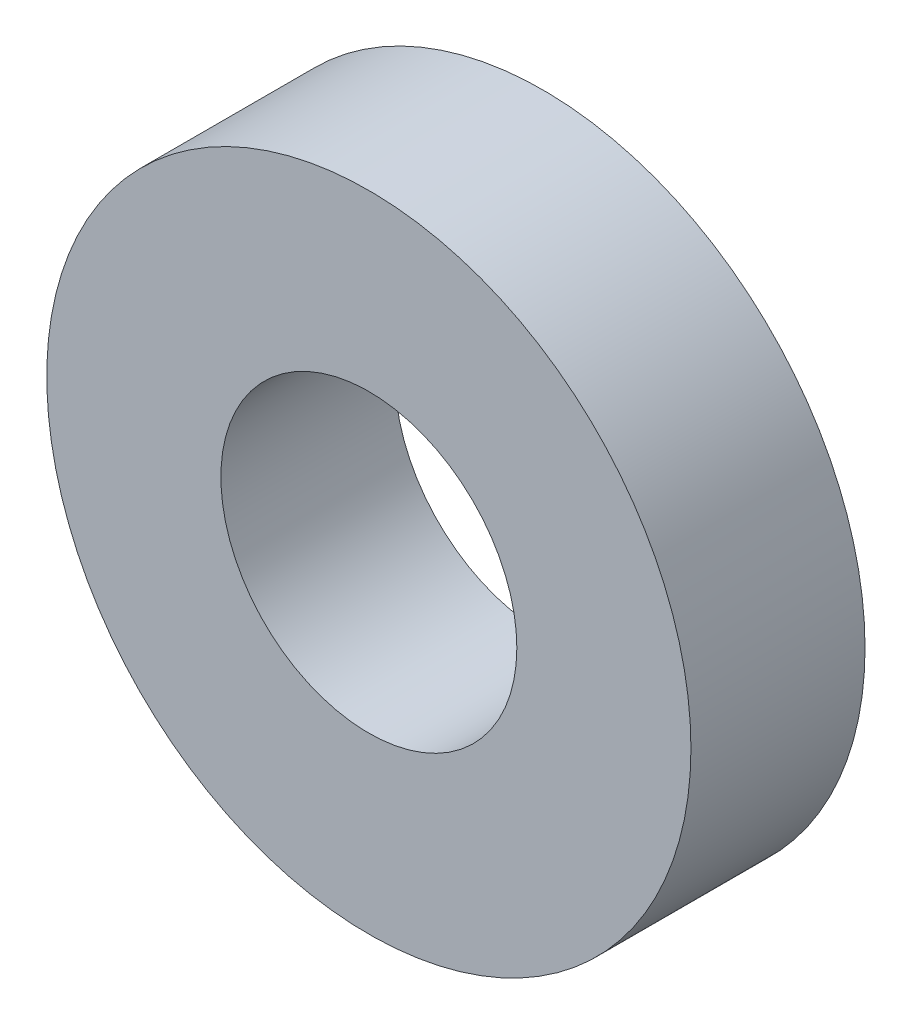
ISO-10303-21;
HEADER;
FILE_DESCRIPTION(('STEP AP214'),'2;1');
FILE_NAME('part.step','',(''),(''),'','','');
FILE_SCHEMA(('AUTOMOTIVE_DESIGN { 1 0 10303 214 1 1 1 1 }'));
ENDSEC;
DATA;
#1=APPLICATION_CONTEXT('core data for automotive mechanical design processes');
#2=APPLICATION_PROTOCOL_DEFINITION('international standard','automotive_design',2000,#1);
#3=PRODUCT_CONTEXT('',#1,'mechanical');
#4=PRODUCT('Part','Part','',(#3));
#5=PRODUCT_RELATED_PRODUCT_CATEGORY('part','',(#4));
#6=PRODUCT_DEFINITION_FORMATION('','',#4);
#7=PRODUCT_DEFINITION_CONTEXT('part definition',#1,'design');
#8=PRODUCT_DEFINITION('design','',#6,#7);
#9=PRODUCT_DEFINITION_SHAPE('','',#8);
#10=(LENGTH_UNIT() NAMED_UNIT(*) SI_UNIT(.MILLI.,.METRE.));
#11=(NAMED_UNIT(*) PLANE_ANGLE_UNIT() SI_UNIT($,.RADIAN.));
#12=(NAMED_UNIT(*) SI_UNIT($,.STERADIAN.) SOLID_ANGLE_UNIT());
#13=UNCERTAINTY_MEASURE_WITH_UNIT(LENGTH_MEASURE(1.E-05),#10,'distance_accuracy_value','');
#14=(GEOMETRIC_REPRESENTATION_CONTEXT(3) GLOBAL_UNCERTAINTY_ASSIGNED_CONTEXT((#13)) GLOBAL_UNIT_ASSIGNED_CONTEXT((#10,
#11,#12)) REPRESENTATION_CONTEXT('',''));
#15=CARTESIAN_POINT('',(0.,0.,0.));
#16=DIRECTION('',(0.,0.,1.));
#17=DIRECTION('',(1.,0.,0.));
#18=AXIS2_PLACEMENT_3D('',#15,#16,#17);
#19=CARTESIAN_POINT('',(0.,0.,10.));
#20=DIRECTION('',(0.,0.,1.));
#21=DIRECTION('',(1.,0.,0.));
#22=AXIS2_PLACEMENT_3D('',#19,#20,#21);
#23=PLANE('',#22);
#24=CARTESIAN_POINT('',(0.,0.,10.));
#25=DIRECTION('',(0.,0.,1.));
#26=DIRECTION('',(1.,0.,0.));
#27=AXIS2_PLACEMENT_3D('',#24,#25,#26);
#28=CIRCLE('',#27,18.5);
#29=CARTESIAN_POINT('',(18.5,0.,10.));
#30=VERTEX_POINT('',#29);
#31=EDGE_CURVE('E10',#30,#30,#28,.T.);
#32=ORIENTED_EDGE('',*,*,#31,.T.);
#33=EDGE_LOOP('',(#32));
#34=FACE_BOUND('',#33,.T.);
#35=CARTESIAN_POINT('',(0.,0.,10.));
#36=DIRECTION('',(0.,0.,1.));
#37=DIRECTION('',(1.,0.,0.));
#38=AXIS2_PLACEMENT_3D('',#35,#36,#37);
#39=CIRCLE('',#38,8.5);
#40=CARTESIAN_POINT('',(8.5,0.,10.));
#41=VERTEX_POINT('',#40);
#42=EDGE_CURVE('E51',#41,#41,#39,.T.);
#43=ORIENTED_EDGE('',*,*,#42,.F.);
#44=EDGE_LOOP('',(#43));
#45=FACE_BOUND('',#44,.T.);
#46=ADVANCED_FACE('F40',(#34,#45),#23,.T.);
#47=CARTESIAN_POINT('',(0.,0.,0.));
#48=DIRECTION('',(0.,0.,1.));
#49=DIRECTION('',(1.,0.,0.));
#50=AXIS2_PLACEMENT_3D('',#47,#48,#49);
#51=PLANE('',#50);
#52=CARTESIAN_POINT('',(0.,0.,0.));
#53=DIRECTION('',(0.,0.,1.));
#54=DIRECTION('',(1.,0.,0.));
#55=AXIS2_PLACEMENT_3D('',#52,#53,#54);
#56=CIRCLE('',#55,18.5);
#57=CARTESIAN_POINT('',(18.5,0.,0.));
#58=VERTEX_POINT('',#57);
#59=EDGE_CURVE('E44',#58,#58,#56,.T.);
#60=ORIENTED_EDGE('',*,*,#59,.F.);
#61=EDGE_LOOP('',(#60));
#62=FACE_BOUND('',#61,.T.);
#63=CARTESIAN_POINT('',(0.,0.,0.));
#64=DIRECTION('',(0.,0.,1.));
#65=DIRECTION('',(1.,0.,0.));
#66=AXIS2_PLACEMENT_3D('',#63,#64,#65);
#67=CIRCLE('',#66,8.5);
#68=CARTESIAN_POINT('',(8.5,0.,0.));
#69=VERTEX_POINT('',#68);
#70=EDGE_CURVE('E53',#69,#69,#67,.T.);
#71=ORIENTED_EDGE('',*,*,#70,.T.);
#72=EDGE_LOOP('',(#71));
#73=FACE_BOUND('',#72,.T.);
#74=ADVANCED_FACE('F63',(#62,#73),#51,.F.);
#75=CARTESIAN_POINT('',(0.,0.,10.));
#76=DIRECTION('',(0.,0.,-1.));
#77=DIRECTION('',(-1.,0.,0.));
#78=AXIS2_PLACEMENT_3D('',#75,#76,#77);
#79=CYLINDRICAL_SURFACE('',#78,18.5);
#80=ORIENTED_EDGE('',*,*,#31,.F.);
#81=EDGE_LOOP('',(#80));
#82=FACE_BOUND('',#81,.T.);
#83=ORIENTED_EDGE('',*,*,#59,.T.);
#84=EDGE_LOOP('',(#83));
#85=FACE_BOUND('',#84,.T.);
#86=ADVANCED_FACE('F42',(#82,#85),#79,.T.);
#87=CARTESIAN_POINT('',(0.,0.,10.));
#88=DIRECTION('',(0.,0.,-1.));
#89=DIRECTION('',(-1.,0.,0.));
#90=AXIS2_PLACEMENT_3D('',#87,#88,#89);
#91=CYLINDRICAL_SURFACE('',#90,8.5);
#92=ORIENTED_EDGE('',*,*,#42,.T.);
#93=EDGE_LOOP('',(#92));
#94=FACE_BOUND('',#93,.T.);
#95=ORIENTED_EDGE('',*,*,#70,.F.);
#96=EDGE_LOOP('',(#95));
#97=FACE_BOUND('',#96,.T.);
#98=ADVANCED_FACE('F59',(#94,#97),#91,.F.);
#99=CLOSED_SHELL('',(#46,#74,#86,#98));
#100=MANIFOLD_SOLID_BREP('B2',#99);
#101=ADVANCED_BREP_SHAPE_REPRESENTATION('',(#18,#100),#14);
#102=SHAPE_DEFINITION_REPRESENTATION(#9,#101);
ENDSEC;
END-ISO-10303-21;
